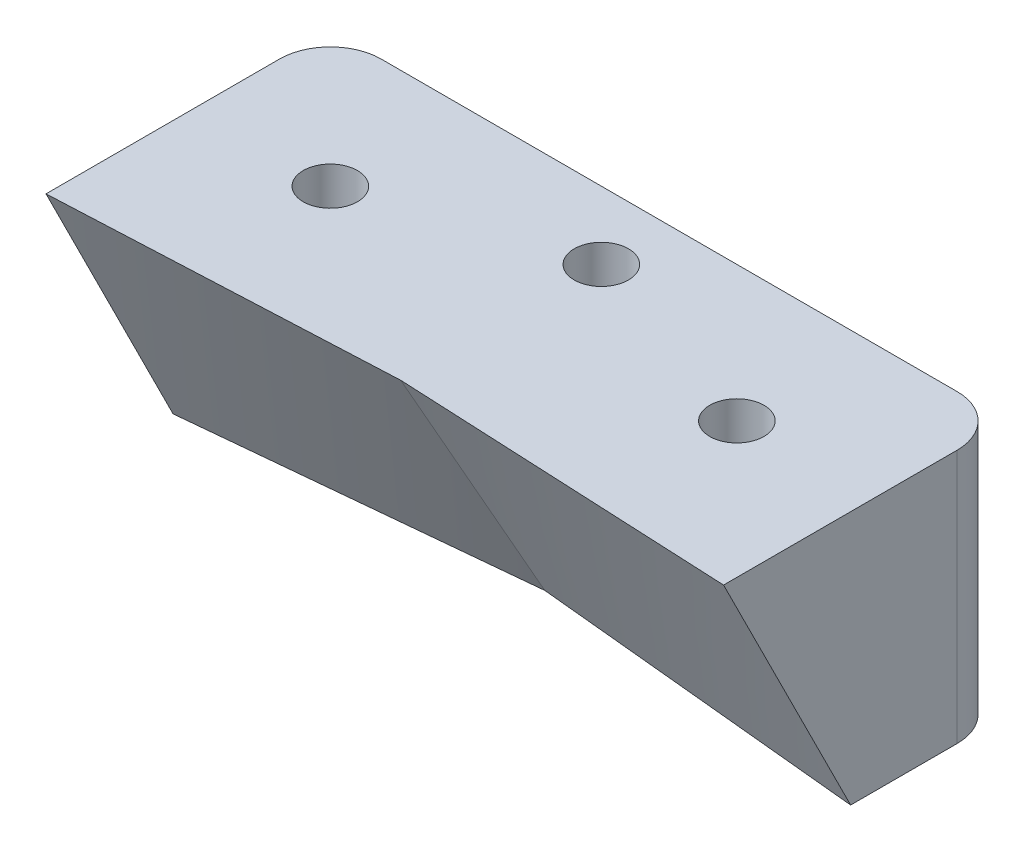
ISO-10303-21;
HEADER;
FILE_DESCRIPTION(('STEP AP214'),'2;1');
FILE_NAME('part.step','',(''),(''),'','','');
FILE_SCHEMA(('AUTOMOTIVE_DESIGN { 1 0 10303 214 1 1 1 1 }'));
ENDSEC;
DATA;
#1=APPLICATION_CONTEXT('core data for automotive mechanical design processes');
#2=APPLICATION_PROTOCOL_DEFINITION('international standard','automotive_design',2000,#1);
#3=PRODUCT_CONTEXT('',#1,'mechanical');
#4=PRODUCT('Part','Part','',(#3));
#5=PRODUCT_RELATED_PRODUCT_CATEGORY('part','',(#4));
#6=PRODUCT_DEFINITION_FORMATION('','',#4);
#7=PRODUCT_DEFINITION_CONTEXT('part definition',#1,'design');
#8=PRODUCT_DEFINITION('design','',#6,#7);
#9=PRODUCT_DEFINITION_SHAPE('','',#8);
#10=(LENGTH_UNIT() NAMED_UNIT(*) SI_UNIT(.MILLI.,.METRE.));
#11=(NAMED_UNIT(*) PLANE_ANGLE_UNIT() SI_UNIT($,.RADIAN.));
#12=(NAMED_UNIT(*) SI_UNIT($,.STERADIAN.) SOLID_ANGLE_UNIT());
#13=UNCERTAINTY_MEASURE_WITH_UNIT(LENGTH_MEASURE(1.E-05),#10,'distance_accuracy_value','');
#14=(GEOMETRIC_REPRESENTATION_CONTEXT(3) GLOBAL_UNCERTAINTY_ASSIGNED_CONTEXT((#13)) GLOBAL_UNIT_ASSIGNED_CONTEXT((#10,
#11,#12)) REPRESENTATION_CONTEXT('',''));
#15=CARTESIAN_POINT('',(0.,0.,0.));
#16=DIRECTION('',(0.,0.,1.));
#17=DIRECTION('',(1.,0.,0.));
#18=AXIS2_PLACEMENT_3D('',#15,#16,#17);
#19=CARTESIAN_POINT('',(0.,0.,-30.));
#20=DIRECTION('',(0.,0.,1.));
#21=DIRECTION('',(1.,0.,0.));
#22=AXIS2_PLACEMENT_3D('',#19,#20,#21);
#23=PLANE('',#22);
#24=DIRECTION('',(-1.,0.,0.));
#25=VECTOR('',#24,1.);
#26=CARTESIAN_POINT('',(-20.,435.,-30.));
#27=LINE('',#26,#25);
#28=CARTESIAN_POINT('',(17.,435.,-30.));
#29=VERTEX_POINT('',#28);
#30=CARTESIAN_POINT('',(-17.,435.,-30.));
#31=VERTEX_POINT('',#30);
#32=EDGE_CURVE('E120',#29,#31,#27,.T.);
#33=ORIENTED_EDGE('',*,*,#32,.F.);
#34=DIRECTION('',(0.,1.,0.));
#35=VECTOR('',#34,1.);
#36=CARTESIAN_POINT('',(17.,419.995,-30.));
#37=LINE('',#36,#35);
#38=CARTESIAN_POINT('',(17.,420.,-30.));
#39=VERTEX_POINT('',#38);
#40=EDGE_CURVE('E95',#39,#29,#37,.T.);
#41=ORIENTED_EDGE('',*,*,#40,.F.);
#42=DIRECTION('',(1.,0.,0.));
#43=VECTOR('',#42,1.);
#44=CARTESIAN_POINT('',(-20.,420.,-30.));
#45=LINE('',#44,#43);
#46=CARTESIAN_POINT('',(-17.,420.,-30.));
#47=VERTEX_POINT('',#46);
#48=EDGE_CURVE('E212',#47,#39,#45,.T.);
#49=ORIENTED_EDGE('',*,*,#48,.F.);
#50=DIRECTION('',(0.,1.,0.));
#51=VECTOR('',#50,1.);
#52=CARTESIAN_POINT('',(-17.,419.995,-30.));
#53=LINE('',#52,#51);
#54=EDGE_CURVE('E100',#47,#31,#53,.T.);
#55=ORIENTED_EDGE('',*,*,#54,.T.);
#56=EDGE_LOOP('',(#33,#41,#49,#55));
#57=FACE_BOUND('',#56,.T.);
#58=ADVANCED_FACE('F35',(#57),#23,.F.);
#59=CARTESIAN_POINT('',(20.,435.,-5.));
#60=DIRECTION('',(-1.,0.,0.));
#61=DIRECTION('',(0.,0.,1.));
#62=AXIS2_PLACEMENT_3D('',#59,#60,#61);
#63=PLANE('',#62);
#64=DIRECTION('',(0.,1.,0.));
#65=VECTOR('',#64,1.);
#66=CARTESIAN_POINT('',(20.,419.995,-27.));
#67=LINE('',#66,#65);
#68=CARTESIAN_POINT('',(20.,420.,-27.));
#69=VERTEX_POINT('',#68);
#70=CARTESIAN_POINT('',(20.,435.,-27.));
#71=VERTEX_POINT('',#70);
#72=EDGE_CURVE('E51',#69,#71,#67,.T.);
#73=ORIENTED_EDGE('',*,*,#72,.T.);
#74=DIRECTION('',(0.,0.,-1.));
#75=VECTOR('',#74,1.);
#76=CARTESIAN_POINT('',(20.,435.,-5.));
#77=LINE('',#76,#75);
#78=CARTESIAN_POINT('',(20.,435.,-13.2143011895849));
#79=VERTEX_POINT('',#78);
#80=EDGE_CURVE('E107',#79,#71,#77,.T.);
#81=ORIENTED_EDGE('',*,*,#80,.F.);
#82=CARTESIAN_POINT('',(20.,420.,-20.7159356321945));
#83=CARTESIAN_POINT('',(20.,420.834072347357,-20.3006568882322));
#84=CARTESIAN_POINT('',(20.,421.668017628862,-19.8851229514754));
#85=CARTESIAN_POINT('',(20.,423.33565750999,-19.053553786611));
#86=CARTESIAN_POINT('',(20.,424.169352109785,-18.6375185588474));
#87=CARTESIAN_POINT('',(20.,425.836494945997,-17.8049554740817));
#88=CARTESIAN_POINT('',(20.,426.669943182494,-17.3884276172423));
#89=CARTESIAN_POINT('',(20.,428.336597466264,-16.5548876841515));
#90=CARTESIAN_POINT('',(20.,429.16980351354,-16.1378756079075));
#91=CARTESIAN_POINT('',(20.,430.83597756054,-15.3033754531929));
#92=CARTESIAN_POINT('',(20.,431.668945560182,-14.8858873745578));
#93=CARTESIAN_POINT('',(20.,433.334647516689,-14.0504431980272));
#94=CARTESIAN_POINT('',(20.,434.167381473397,-13.63248709982));
#95=CARTESIAN_POINT('',(20.,435.,-13.214301189585));
#96=B_SPLINE_CURVE_WITH_KNOTS('',3,(#82,#83,#84,#85,#86,#87,#88,#89,#90,#91,#92,#93,#94,#95),
.UNSPECIFIED.,.F.,.F.,(4,2,2,2,2,2,4),(0.,2.79520978568898,5.59041765482563,8.38562460152697,
11.180831504984,13.9760393741184,16.7712491057355),.UNSPECIFIED.);
#97=CARTESIAN_POINT('',(20.,420.,-20.7159356321945));
#98=VERTEX_POINT('',#97);
#99=EDGE_CURVE('E190',#98,#79,#96,.T.);
#100=ORIENTED_EDGE('',*,*,#99,.F.);
#101=DIRECTION('',(0.,0.,-1.));
#102=VECTOR('',#101,1.);
#103=CARTESIAN_POINT('',(20.,420.,-5.));
#104=LINE('',#103,#102);
#105=EDGE_CURVE('E109',#98,#69,#104,.T.);
#106=ORIENTED_EDGE('',*,*,#105,.T.);
#107=EDGE_LOOP('',(#73,#81,#100,#106));
#108=FACE_BOUND('',#107,.T.);
#109=ADVANCED_FACE('F105',(#108),#63,.F.);
#110=CARTESIAN_POINT('',(-20.,435.,-5.));
#111=DIRECTION('',(0.,-1.,0.));
#112=DIRECTION('',(0.,0.,-1.));
#113=AXIS2_PLACEMENT_3D('',#110,#111,#112);
#114=PLANE('',#113);
#115=CARTESIAN_POINT('',(-12.,435.,-22.));
#116=DIRECTION('',(0.,1.,0.));
#117=DIRECTION('',(0.,0.,1.));
#118=AXIS2_PLACEMENT_3D('',#115,#116,#117);
#119=CIRCLE('',#118,1.59999999999998);
#120=CARTESIAN_POINT('',(-12.,435.,-20.4));
#121=VERTEX_POINT('',#120);
#122=EDGE_CURVE('E228',#121,#121,#119,.T.);
#123=ORIENTED_EDGE('',*,*,#122,.F.);
#124=EDGE_LOOP('',(#123));
#125=FACE_BOUND('',#124,.T.);
#126=CARTESIAN_POINT('',(0.,435.,-26.));
#127=DIRECTION('',(0.,1.,0.));
#128=DIRECTION('',(0.,0.,1.));
#129=AXIS2_PLACEMENT_3D('',#126,#127,#128);
#130=CIRCLE('',#129,1.6);
#131=CARTESIAN_POINT('',(0.,435.,-24.4));
#132=VERTEX_POINT('',#131);
#133=EDGE_CURVE('E234',#132,#132,#130,.T.);
#134=ORIENTED_EDGE('',*,*,#133,.F.);
#135=EDGE_LOOP('',(#134));
#136=FACE_BOUND('',#135,.T.);
#137=CARTESIAN_POINT('',(12.,435.,-22.));
#138=DIRECTION('',(0.,1.,0.));
#139=DIRECTION('',(0.,0.,1.));
#140=AXIS2_PLACEMENT_3D('',#137,#138,#139);
#141=CIRCLE('',#140,1.6);
#142=CARTESIAN_POINT('',(12.,435.,-20.4));
#143=VERTEX_POINT('',#142);
#144=EDGE_CURVE('E224',#143,#143,#141,.T.);
#145=ORIENTED_EDGE('',*,*,#144,.F.);
#146=EDGE_LOOP('',(#145));
#147=FACE_BOUND('',#146,.T.);
#148=ORIENTED_EDGE('',*,*,#80,.T.);
#149=CARTESIAN_POINT('',(17.,435.,-27.));
#150=DIRECTION('',(0.,-1.,0.));
#151=DIRECTION('',(0.,0.,1.));
#152=AXIS2_PLACEMENT_3D('',#149,#150,#151);
#153=CIRCLE('',#152,2.99999999999999);
#154=EDGE_CURVE('E92',#29,#71,#153,.T.);
#155=ORIENTED_EDGE('',*,*,#154,.F.);
#156=ORIENTED_EDGE('',*,*,#32,.T.);
#157=CARTESIAN_POINT('',(-17.,435.,-27.));
#158=DIRECTION('',(0.,-1.,0.));
#159=DIRECTION('',(0.,0.,1.));
#160=AXIS2_PLACEMENT_3D('',#157,#158,#159);
#161=CIRCLE('',#160,3.);
#162=CARTESIAN_POINT('',(-20.,435.,-27.));
#163=VERTEX_POINT('',#162);
#164=EDGE_CURVE('E216',#163,#31,#161,.T.);
#165=ORIENTED_EDGE('',*,*,#164,.F.);
#166=DIRECTION('',(0.,0.,-1.));
#167=VECTOR('',#166,1.);
#168=CARTESIAN_POINT('',(-20.,435.,-5.));
#169=LINE('',#168,#167);
#170=CARTESIAN_POINT('',(-20.,435.,-13.2143011895849));
#171=VERTEX_POINT('',#170);
#172=EDGE_CURVE('E115',#171,#163,#169,.T.);
#173=ORIENTED_EDGE('',*,*,#172,.F.);
#174=CARTESIAN_POINT('',(0.,435.,-14.1552215133836));
#175=CARTESIAN_POINT('',(-6.66666666666667,435.,-13.8415814054507));
#176=CARTESIAN_POINT('',(-13.3333333333333,435.,-13.5279412975178));
#177=CARTESIAN_POINT('',(-20.,435.,-13.2143011895849));
#178=B_SPLINE_CURVE_WITH_KNOTS('',3,(#174,#175,#176,#177),.UNSPECIFIED.,.F.,.F.,(4,4),(0.,
20.02212104288),.UNSPECIFIED.);
#179=CARTESIAN_POINT('',(0.,435.,-14.1552215133836));
#180=VERTEX_POINT('',#179);
#181=EDGE_CURVE('E127',#180,#171,#178,.T.);
#182=ORIENTED_EDGE('',*,*,#181,.F.);
#183=CARTESIAN_POINT('',(20.,435.,-13.2143011895849));
#184=CARTESIAN_POINT('',(13.3333333333333,435.,-13.5279412975178));
#185=CARTESIAN_POINT('',(6.66666666666667,435.,-13.8415814054507));
#186=CARTESIAN_POINT('',(0.,435.,-14.1552215133837));
#187=B_SPLINE_CURVE_WITH_KNOTS('',3,(#183,#184,#185,#186),.UNSPECIFIED.,.F.,.F.,(4,4),(0.,
20.02212104288),.UNSPECIFIED.);
#188=EDGE_CURVE('E114',#79,#180,#187,.T.);
#189=ORIENTED_EDGE('',*,*,#188,.F.);
#190=EDGE_LOOP('',(#148,#155,#156,#165,#173,#182,#189));
#191=FACE_BOUND('',#190,.T.);
#192=ADVANCED_FACE('F112',(#125,#136,#147,#191),#114,.F.);
#193=CARTESIAN_POINT('',(-20.,420.,-5.));
#194=DIRECTION('',(0.,1.,0.));
#195=DIRECTION('',(0.,0.,1.));
#196=AXIS2_PLACEMENT_3D('',#193,#194,#195);
#197=PLANE('',#196);
#198=ORIENTED_EDGE('',*,*,#48,.T.);
#199=CARTESIAN_POINT('',(17.,420.,-27.));
#200=DIRECTION('',(0.,1.,0.));
#201=DIRECTION('',(0.,0.,1.));
#202=AXIS2_PLACEMENT_3D('',#199,#200,#201);
#203=CIRCLE('',#202,2.99999999999999);
#204=EDGE_CURVE('E11',#39,#69,#203,.F.);
#205=ORIENTED_EDGE('',*,*,#204,.T.);
#206=ORIENTED_EDGE('',*,*,#105,.F.);
#207=CARTESIAN_POINT('',(0.,420.,-22.6601265790764));
#208=CARTESIAN_POINT('',(6.66666666666667,420.,-22.0120629301158));
#209=CARTESIAN_POINT('',(13.3333333333333,420.,-21.3639992811552));
#210=CARTESIAN_POINT('',(20.,420.,-20.7159356321946));
#211=B_SPLINE_CURVE_WITH_KNOTS('',3,(#207,#208,#209,#210),.UNSPECIFIED.,.F.,.F.,(4,4),(0.,
20.094274767653),.UNSPECIFIED.);
#212=CARTESIAN_POINT('',(0.,420.,-22.6601265790764));
#213=VERTEX_POINT('',#212);
#214=EDGE_CURVE('E195',#213,#98,#211,.T.);
#215=ORIENTED_EDGE('',*,*,#214,.F.);
#216=CARTESIAN_POINT('',(-20.,420.,-20.7159356321945));
#217=CARTESIAN_POINT('',(-13.3333333333333,420.,-21.3639992811551));
#218=CARTESIAN_POINT('',(-6.66666666666667,420.,-22.0120629301158));
#219=CARTESIAN_POINT('',(0.,420.,-22.6601265790764));
#220=B_SPLINE_CURVE_WITH_KNOTS('',3,(#216,#217,#218,#219),.UNSPECIFIED.,.F.,.F.,(4,4),(0.,
20.094274767653),.UNSPECIFIED.);
#221=CARTESIAN_POINT('',(-20.,420.,-20.7159356321945));
#222=VERTEX_POINT('',#221);
#223=EDGE_CURVE('E211',#222,#213,#220,.T.);
#224=ORIENTED_EDGE('',*,*,#223,.F.);
#225=DIRECTION('',(0.,0.,-1.));
#226=VECTOR('',#225,1.);
#227=CARTESIAN_POINT('',(-20.,420.,-5.));
#228=LINE('',#227,#226);
#229=CARTESIAN_POINT('',(-20.,420.,-27.));
#230=VERTEX_POINT('',#229);
#231=EDGE_CURVE('E117',#222,#230,#228,.T.);
#232=ORIENTED_EDGE('',*,*,#231,.T.);
#233=CARTESIAN_POINT('',(-17.,420.,-27.));
#234=DIRECTION('',(0.,1.,0.));
#235=DIRECTION('',(0.,0.,1.));
#236=AXIS2_PLACEMENT_3D('',#233,#234,#235);
#237=CIRCLE('',#236,3.);
#238=EDGE_CURVE('E58',#230,#47,#237,.F.);
#239=ORIENTED_EDGE('',*,*,#238,.T.);
#240=EDGE_LOOP('',(#198,#205,#206,#215,#224,#232,#239));
#241=FACE_BOUND('',#240,.T.);
#242=ADVANCED_FACE('F198',(#241),#197,.F.);
#243=CARTESIAN_POINT('',(-20.,435.,-5.));
#244=DIRECTION('',(1.,0.,0.));
#245=DIRECTION('',(0.,1.,0.));
#246=AXIS2_PLACEMENT_3D('',#243,#244,#245);
#247=PLANE('',#246);
#248=ORIENTED_EDGE('',*,*,#172,.T.);
#249=DIRECTION('',(0.,1.,0.));
#250=VECTOR('',#249,1.);
#251=CARTESIAN_POINT('',(-20.,419.995,-27.));
#252=LINE('',#251,#250);
#253=EDGE_CURVE('E44',#163,#230,#252,.F.);
#254=ORIENTED_EDGE('',*,*,#253,.T.);
#255=ORIENTED_EDGE('',*,*,#231,.F.);
#256=CARTESIAN_POINT('',(-20.,435.,-13.2143011895849));
#257=CARTESIAN_POINT('',(-20.,434.167381473397,-13.6324870998199));
#258=CARTESIAN_POINT('',(-20.,433.334647516689,-14.0504431980272));
#259=CARTESIAN_POINT('',(-20.,431.668945560183,-14.8858873745578));
#260=CARTESIAN_POINT('',(-20.,430.83597756054,-15.3033754531929));
#261=CARTESIAN_POINT('',(-20.,429.16980351354,-16.1378756079075));
#262=CARTESIAN_POINT('',(-20.,428.336597466264,-16.5548876841514));
#263=CARTESIAN_POINT('',(-20.,426.669943182494,-17.3884276172423));
#264=CARTESIAN_POINT('',(-20.,425.836494945997,-17.8049554740817));
#265=CARTESIAN_POINT('',(-20.,424.169352109785,-18.6375185588475));
#266=CARTESIAN_POINT('',(-20.,423.33565750999,-19.0535537866111));
#267=CARTESIAN_POINT('',(-20.,421.668017628862,-19.8851229514754));
#268=CARTESIAN_POINT('',(-20.,420.834072347357,-20.3006568882322));
#269=CARTESIAN_POINT('',(-20.,420.,-20.7159356321946));
#270=B_SPLINE_CURVE_WITH_KNOTS('',3,(#256,#257,#258,#259,#260,#261,#262,#263,#264,#265,#266,
#267,#268,#269),.UNSPECIFIED.,.F.,.F.,(4,2,2,2,2,2,4),(0.,2.79520973161705,5.59041760075153,
8.38562450420861,11.1808314509101,13.9760393200467,16.7712491057357),.UNSPECIFIED.);
#271=EDGE_CURVE('E329',#171,#222,#270,.T.);
#272=ORIENTED_EDGE('',*,*,#271,.F.);
#273=EDGE_LOOP('',(#248,#254,#255,#272));
#274=FACE_BOUND('',#273,.T.);
#275=ADVANCED_FACE('F37',(#274),#247,.F.);
#276=CARTESIAN_POINT('',(0.,450.,-5.65031644769089));
#277=CARTESIAN_POINT('',(0.,433.333333333333,-15.1002109651273));
#278=CARTESIAN_POINT('',(0.,416.666666666667,-24.5501054825636));
#279=CARTESIAN_POINT('',(0.,400.,-34.));
#280=CARTESIAN_POINT('',(21.9374589553905,450.,-5.65031644769089));
#281=CARTESIAN_POINT('',(21.18004332565,433.333333333333,-13.9890998540162));
#282=CARTESIAN_POINT('',(20.4226276959095,416.666666666667,-22.3278832603414));
#283=CARTESIAN_POINT('',(19.665212066169,400.,-30.6666666666667));
#284=CARTESIAN_POINT('',(43.874917910781,450.,-5.65031644769089));
#285=CARTESIAN_POINT('',(42.3600866513,433.333333333333,-12.877988742905));
#286=CARTESIAN_POINT('',(40.845255391819,416.666666666667,-20.1056610381192));
#287=CARTESIAN_POINT('',(39.330424132338,400.,-27.3333333333333));
#288=CARTESIAN_POINT('',(65.8123768661716,450.,-5.65031644769089));
#289=CARTESIAN_POINT('',(63.54012997695,433.333333333333,-11.7668776317939));
#290=CARTESIAN_POINT('',(61.2678830877285,416.666666666667,-17.883438815897));
#291=CARTESIAN_POINT('',(58.995636198507,400.,-24.));
#292=B_SPLINE_SURFACE_WITH_KNOTS('',3,3,((#276,#277,#278,#279),(#280,#281,#282,#283),(#284,#285,
#286,#287),(#288,#289,#290,#291)),.UNSPECIFIED.,.F.,.F.,.F.,(4,4),(4,4),(0.,1.),(0.,1.),.UNSPECIFIED.);
#293=CARTESIAN_POINT('',(0.,400.,-34.));
#294=CARTESIAN_POINT('',(0.,416.666666666667,-24.5501054825636));
#295=CARTESIAN_POINT('',(0.,433.333333333333,-15.1002109651273));
#296=CARTESIAN_POINT('',(0.,450.,-5.65031644769089));
#297=B_SPLINE_CURVE_WITH_KNOTS('',3,(#293,#294,#295,#296),.UNSPECIFIED.,.F.,.F.,(4,4),(0.,1.),.UNSPECIFIED.);
#298=EDGE_CURVE('E187',#213,#180,#297,.T.);
#299=ORIENTED_EDGE('',*,*,#214,.T.);
#300=ORIENTED_EDGE('',*,*,#99,.T.);
#301=ORIENTED_EDGE('',*,*,#188,.T.);
#302=ORIENTED_EDGE('',*,*,#298,.F.);
#303=EDGE_LOOP('',(#299,#300,#301,#302));
#304=FACE_BOUND('',#303,.T.);
#305=ADVANCED_FACE('F140',(#304),#292,.F.);
#306=CARTESIAN_POINT('',(0.,450.,-5.65031644769089));
#307=CARTESIAN_POINT('',(0.,433.333333333333,-15.1002109651273));
#308=CARTESIAN_POINT('',(0.,416.666666666667,-24.5501054825636));
#309=CARTESIAN_POINT('',(0.,400.,-34.));
#310=CARTESIAN_POINT('',(-21.9374589553905,450.,-5.65031644769089));
#311=CARTESIAN_POINT('',(-21.18004332565,433.333333333333,-13.9890998540162));
#312=CARTESIAN_POINT('',(-20.4226276959095,416.666666666667,-22.3278832603414));
#313=CARTESIAN_POINT('',(-19.665212066169,400.,-30.6666666666667));
#314=CARTESIAN_POINT('',(-43.874917910781,450.,-5.65031644769089));
#315=CARTESIAN_POINT('',(-42.3600866513,433.333333333333,-12.877988742905));
#316=CARTESIAN_POINT('',(-40.845255391819,416.666666666667,-20.1056610381192));
#317=CARTESIAN_POINT('',(-39.330424132338,400.,-27.3333333333333));
#318=CARTESIAN_POINT('',(-65.8123768661716,450.,-5.65031644769089));
#319=CARTESIAN_POINT('',(-63.54012997695,433.333333333333,-11.7668776317939));
#320=CARTESIAN_POINT('',(-61.2678830877285,416.666666666667,-17.883438815897));
#321=CARTESIAN_POINT('',(-58.995636198507,400.,-24.));
#322=B_SPLINE_SURFACE_WITH_KNOTS('',3,3,((#306,#307,#308,#309),(#310,#311,#312,#313),(#314,#315,
#316,#317),(#318,#319,#320,#321)),.UNSPECIFIED.,.F.,.F.,.F.,(4,4),(4,4),(0.,1.),(0.,1.),.UNSPECIFIED.);
#323=ORIENTED_EDGE('',*,*,#223,.T.);
#324=ORIENTED_EDGE('',*,*,#298,.T.);
#325=ORIENTED_EDGE('',*,*,#181,.T.);
#326=ORIENTED_EDGE('',*,*,#271,.T.);
#327=EDGE_LOOP('',(#323,#324,#325,#326));
#328=FACE_BOUND('',#327,.T.);
#329=ADVANCED_FACE('F147',(#328),#322,.T.);
#330=CARTESIAN_POINT('',(12.,428.,-22.));
#331=DIRECTION('',(0.,1.,0.));
#332=DIRECTION('',(0.,0.,1.));
#333=AXIS2_PLACEMENT_3D('',#330,#331,#332);
#334=CYLINDRICAL_SURFACE('',#333,1.6);
#335=CARTESIAN_POINT('',(12.,428.,-22.));
#336=DIRECTION('',(0.,1.,0.));
#337=DIRECTION('',(0.,0.,1.));
#338=AXIS2_PLACEMENT_3D('',#335,#336,#337);
#339=CIRCLE('',#338,1.6);
#340=CARTESIAN_POINT('',(12.,428.,-20.4));
#341=VERTEX_POINT('',#340);
#342=EDGE_CURVE('E237',#341,#341,#339,.T.);
#343=ORIENTED_EDGE('',*,*,#342,.F.);
#344=EDGE_LOOP('',(#343));
#345=FACE_BOUND('',#344,.T.);
#346=ORIENTED_EDGE('',*,*,#144,.T.);
#347=EDGE_LOOP('',(#346));
#348=FACE_BOUND('',#347,.T.);
#349=ADVANCED_FACE('F149',(#345,#348),#334,.F.);
#350=CARTESIAN_POINT('',(12.,428.,-22.));
#351=DIRECTION('',(0.,1.,0.));
#352=DIRECTION('',(0.,0.,1.));
#353=AXIS2_PLACEMENT_3D('',#350,#351,#352);
#354=PLANE('',#353);
#355=ORIENTED_EDGE('',*,*,#342,.T.);
#356=EDGE_LOOP('',(#355));
#357=FACE_BOUND('',#356,.T.);
#358=ADVANCED_FACE('F313',(#357),#354,.T.);
#359=CARTESIAN_POINT('',(0.,428.,-26.));
#360=DIRECTION('',(0.,1.,0.));
#361=DIRECTION('',(0.,0.,1.));
#362=AXIS2_PLACEMENT_3D('',#359,#360,#361);
#363=CYLINDRICAL_SURFACE('',#362,1.6);
#364=CARTESIAN_POINT('',(0.,428.,-26.));
#365=DIRECTION('',(0.,1.,0.));
#366=DIRECTION('',(0.,0.,1.));
#367=AXIS2_PLACEMENT_3D('',#364,#365,#366);
#368=CIRCLE('',#367,1.6);
#369=CARTESIAN_POINT('',(0.,428.,-24.4));
#370=VERTEX_POINT('',#369);
#371=EDGE_CURVE('E231',#370,#370,#368,.T.);
#372=ORIENTED_EDGE('',*,*,#371,.F.);
#373=EDGE_LOOP('',(#372));
#374=FACE_BOUND('',#373,.T.);
#375=ORIENTED_EDGE('',*,*,#133,.T.);
#376=EDGE_LOOP('',(#375));
#377=FACE_BOUND('',#376,.T.);
#378=ADVANCED_FACE('F310',(#374,#377),#363,.F.);
#379=CARTESIAN_POINT('',(0.,428.,-26.));
#380=DIRECTION('',(0.,1.,0.));
#381=DIRECTION('',(0.,0.,1.));
#382=AXIS2_PLACEMENT_3D('',#379,#380,#381);
#383=PLANE('',#382);
#384=ORIENTED_EDGE('',*,*,#371,.T.);
#385=EDGE_LOOP('',(#384));
#386=FACE_BOUND('',#385,.T.);
#387=ADVANCED_FACE('F306',(#386),#383,.T.);
#388=CARTESIAN_POINT('',(-12.,428.,-22.));
#389=DIRECTION('',(0.,1.,0.));
#390=DIRECTION('',(0.,0.,1.));
#391=AXIS2_PLACEMENT_3D('',#388,#389,#390);
#392=CYLINDRICAL_SURFACE('',#391,1.59999999999998);
#393=CARTESIAN_POINT('',(-12.,428.,-22.));
#394=DIRECTION('',(0.,1.,0.));
#395=DIRECTION('',(0.,0.,1.));
#396=AXIS2_PLACEMENT_3D('',#393,#394,#395);
#397=CIRCLE('',#396,1.59999999999998);
#398=CARTESIAN_POINT('',(-12.,428.,-20.4));
#399=VERTEX_POINT('',#398);
#400=EDGE_CURVE('E225',#399,#399,#397,.T.);
#401=ORIENTED_EDGE('',*,*,#400,.F.);
#402=EDGE_LOOP('',(#401));
#403=FACE_BOUND('',#402,.T.);
#404=ORIENTED_EDGE('',*,*,#122,.T.);
#405=EDGE_LOOP('',(#404));
#406=FACE_BOUND('',#405,.T.);
#407=ADVANCED_FACE('F302',(#403,#406),#392,.F.);
#408=CARTESIAN_POINT('',(-12.,428.,-22.));
#409=DIRECTION('',(0.,1.,0.));
#410=DIRECTION('',(0.,0.,1.));
#411=AXIS2_PLACEMENT_3D('',#408,#409,#410);
#412=PLANE('',#411);
#413=ORIENTED_EDGE('',*,*,#400,.T.);
#414=EDGE_LOOP('',(#413));
#415=FACE_BOUND('',#414,.T.);
#416=ADVANCED_FACE('F287',(#415),#412,.T.);
#417=CARTESIAN_POINT('',(-17.,419.995,-27.));
#418=DIRECTION('',(0.,1.,0.));
#419=DIRECTION('',(0.,0.,1.));
#420=AXIS2_PLACEMENT_3D('',#417,#418,#419);
#421=CYLINDRICAL_SURFACE('',#420,3.);
#422=ORIENTED_EDGE('',*,*,#253,.F.);
#423=ORIENTED_EDGE('',*,*,#164,.T.);
#424=ORIENTED_EDGE('',*,*,#54,.F.);
#425=ORIENTED_EDGE('',*,*,#238,.F.);
#426=EDGE_LOOP('',(#422,#423,#424,#425));
#427=FACE_BOUND('',#426,.T.);
#428=ADVANCED_FACE('F282',(#427),#421,.T.);
#429=CARTESIAN_POINT('',(17.,419.995,-27.));
#430=DIRECTION('',(0.,1.,0.));
#431=DIRECTION('',(0.,0.,1.));
#432=AXIS2_PLACEMENT_3D('',#429,#430,#431);
#433=CYLINDRICAL_SURFACE('',#432,2.99999999999999);
#434=ORIENTED_EDGE('',*,*,#40,.T.);
#435=ORIENTED_EDGE('',*,*,#154,.T.);
#436=ORIENTED_EDGE('',*,*,#72,.F.);
#437=ORIENTED_EDGE('',*,*,#204,.F.);
#438=EDGE_LOOP('',(#434,#435,#436,#437));
#439=FACE_BOUND('',#438,.T.);
#440=ADVANCED_FACE('F93',(#439),#433,.T.);
#441=CLOSED_SHELL('',(#58,#109,#192,#242,#275,#305,#329,#349,#358,#378,#387,#407,#416,#428,#440));
#442=MANIFOLD_SOLID_BREP('B2',#441);
#443=ADVANCED_BREP_SHAPE_REPRESENTATION('',(#18,#442),#14);
#444=SHAPE_DEFINITION_REPRESENTATION(#9,#443);
ENDSEC;
END-ISO-10303-21;
